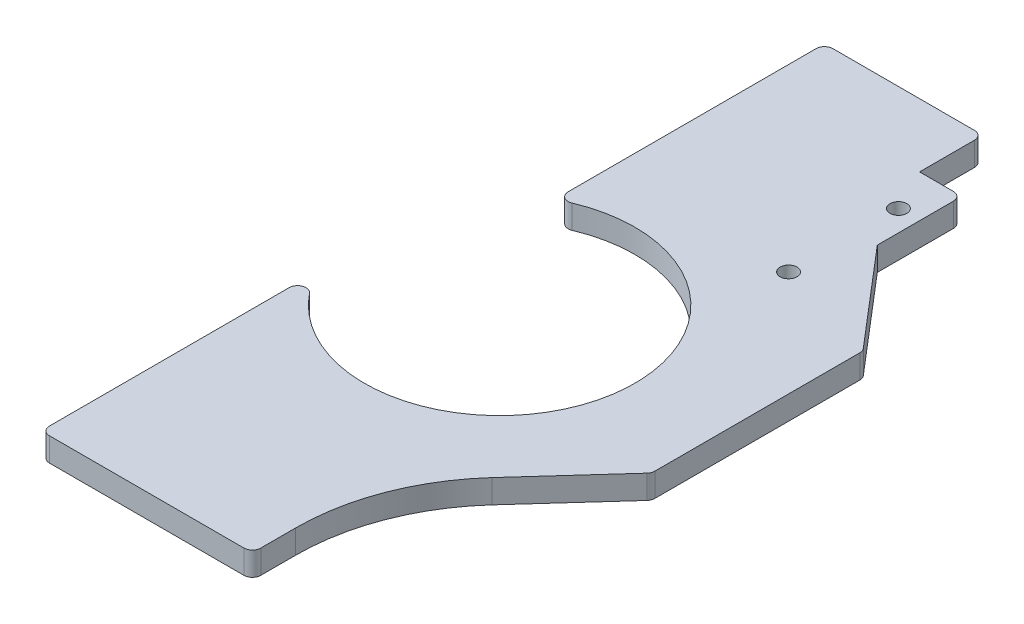
ISO-10303-21;
HEADER;
FILE_DESCRIPTION(('STEP AP214'),'2;1');
FILE_NAME('part.step','',(''),(''),'','','');
FILE_SCHEMA(('AUTOMOTIVE_DESIGN { 1 0 10303 214 1 1 1 1 }'));
ENDSEC;
DATA;
#1=APPLICATION_CONTEXT('core data for automotive mechanical design processes');
#2=APPLICATION_PROTOCOL_DEFINITION('international standard','automotive_design',2000,#1);
#3=PRODUCT_CONTEXT('',#1,'mechanical');
#4=PRODUCT('Part','Part','',(#3));
#5=PRODUCT_RELATED_PRODUCT_CATEGORY('part','',(#4));
#6=PRODUCT_DEFINITION_FORMATION('','',#4);
#7=PRODUCT_DEFINITION_CONTEXT('part definition',#1,'design');
#8=PRODUCT_DEFINITION('design','',#6,#7);
#9=PRODUCT_DEFINITION_SHAPE('','',#8);
#10=(LENGTH_UNIT() NAMED_UNIT(*) SI_UNIT(.MILLI.,.METRE.));
#11=(NAMED_UNIT(*) PLANE_ANGLE_UNIT() SI_UNIT($,.RADIAN.));
#12=(NAMED_UNIT(*) SI_UNIT($,.STERADIAN.) SOLID_ANGLE_UNIT());
#13=UNCERTAINTY_MEASURE_WITH_UNIT(LENGTH_MEASURE(1.E-05),#10,'distance_accuracy_value','');
#14=(GEOMETRIC_REPRESENTATION_CONTEXT(3) GLOBAL_UNCERTAINTY_ASSIGNED_CONTEXT((#13)) GLOBAL_UNIT_ASSIGNED_CONTEXT((#10,
#11,#12)) REPRESENTATION_CONTEXT('',''));
#15=CARTESIAN_POINT('',(0.,0.,0.));
#16=DIRECTION('',(0.,0.,1.));
#17=DIRECTION('',(1.,0.,0.));
#18=AXIS2_PLACEMENT_3D('',#15,#16,#17);
#19=CARTESIAN_POINT('',(15.14,5.6,92.));
#20=DIRECTION('',(0.,1.,0.));
#21=DIRECTION('',(0.,0.,1.));
#22=AXIS2_PLACEMENT_3D('',#19,#20,#21);
#23=PLANE('',#22);
#24=CARTESIAN_POINT('',(42.5,5.6,25.));
#25=DIRECTION('',(0.,1.,0.));
#26=DIRECTION('',(0.,0.,1.));
#27=AXIS2_PLACEMENT_3D('',#24,#25,#26);
#28=CIRCLE('',#27,2.00000000000001);
#29=CARTESIAN_POINT('',(42.5,5.6,27.));
#30=VERTEX_POINT('',#29);
#31=EDGE_CURVE('E395',#30,#30,#28,.T.);
#32=ORIENTED_EDGE('',*,*,#31,.F.);
#33=EDGE_LOOP('',(#32));
#34=FACE_BOUND('',#33,.T.);
#35=DIRECTION('',(0.,0.,1.));
#36=VECTOR('',#35,1.);
#37=CARTESIAN_POINT('',(-13.36,5.6,172.));
#38=LINE('',#37,#36);
#39=CARTESIAN_POINT('',(-13.36,5.6,113.301408404141));
#40=VERTEX_POINT('',#39);
#41=CARTESIAN_POINT('',(-13.36,5.6,170.));
#42=VERTEX_POINT('',#41);
#43=EDGE_CURVE('E281',#40,#42,#38,.T.);
#44=ORIENTED_EDGE('',*,*,#43,.T.);
#45=CARTESIAN_POINT('',(-11.36,5.6,170.));
#46=DIRECTION('',(0.,1.,0.));
#47=DIRECTION('',(0.,0.,1.));
#48=AXIS2_PLACEMENT_3D('',#45,#46,#47);
#49=CIRCLE('',#48,2.);
#50=CARTESIAN_POINT('',(-11.36,5.6,172.));
#51=VERTEX_POINT('',#50);
#52=EDGE_CURVE('E271',#42,#51,#49,.T.);
#53=ORIENTED_EDGE('',*,*,#52,.T.);
#54=DIRECTION('',(1.,0.,0.));
#55=VECTOR('',#54,1.);
#56=CARTESIAN_POINT('',(36.64,5.6,172.));
#57=LINE('',#56,#55);
#58=CARTESIAN_POINT('',(34.64,5.6,172.));
#59=VERTEX_POINT('',#58);
#60=EDGE_CURVE('E285',#51,#59,#57,.T.);
#61=ORIENTED_EDGE('',*,*,#60,.T.);
#62=CARTESIAN_POINT('',(34.64,5.6,170.));
#63=DIRECTION('',(0.,1.,0.));
#64=DIRECTION('',(0.,0.,1.));
#65=AXIS2_PLACEMENT_3D('',#62,#63,#64);
#66=CIRCLE('',#65,2.);
#67=CARTESIAN_POINT('',(36.64,5.6,170.));
#68=VERTEX_POINT('',#67);
#69=EDGE_CURVE('E267',#59,#68,#66,.T.);
#70=ORIENTED_EDGE('',*,*,#69,.T.);
#71=DIRECTION('',(0.,0.,-1.));
#72=VECTOR('',#71,1.);
#73=CARTESIAN_POINT('',(36.64,5.6,142.480487319359));
#74=LINE('',#73,#72);
#75=CARTESIAN_POINT('',(36.64,5.6,161.754308439395));
#76=VERTEX_POINT('',#75);
#77=EDGE_CURVE('E260',#68,#76,#74,.T.);
#78=ORIENTED_EDGE('',*,*,#77,.T.);
#79=CARTESIAN_POINT('',(86.64,5.6,161.754308439395));
#80=DIRECTION('',(0.,1.,0.));
#81=DIRECTION('',(0.,0.,1.));
#82=AXIS2_PLACEMENT_3D('',#79,#80,#81);
#83=CIRCLE('',#82,50.);
#84=CARTESIAN_POINT('',(49.576888197284,5.6,128.193531578611));
#85=VERTEX_POINT('',#84);
#86=EDGE_CURVE('E12',#76,#85,#83,.F.);
#87=ORIENTED_EDGE('',*,*,#86,.T.);
#88=DIRECTION('',(0.671215537215691,0.,-0.74126223605432));
#89=VECTOR('',#88,1.);
#90=CARTESIAN_POINT('',(67.5,5.6,108.4));
#91=LINE('',#90,#89);
#92=CARTESIAN_POINT('',(66.9825244721087,5.6,108.97147822963));
#93=VERTEX_POINT('',#92);
#94=EDGE_CURVE('E256',#85,#93,#91,.T.);
#95=ORIENTED_EDGE('',*,*,#94,.T.);
#96=CARTESIAN_POINT('',(65.5,5.6,107.629047155199));
#97=DIRECTION('',(0.,1.,0.));
#98=DIRECTION('',(0.,0.,1.));
#99=AXIS2_PLACEMENT_3D('',#96,#97,#98);
#100=CIRCLE('',#99,2.);
#101=CARTESIAN_POINT('',(67.5,5.6,107.629047155199));
#102=VERTEX_POINT('',#101);
#103=EDGE_CURVE('E247',#93,#102,#100,.T.);
#104=ORIENTED_EDGE('',*,*,#103,.T.);
#105=DIRECTION('',(0.,0.,-1.));
#106=VECTOR('',#105,1.);
#107=CARTESIAN_POINT('',(67.5,5.6,58.4));
#108=LINE('',#107,#106);
#109=CARTESIAN_POINT('',(67.5,5.6,59.1382462539569));
#110=VERTEX_POINT('',#109);
#111=EDGE_CURVE('E202',#102,#110,#108,.T.);
#112=ORIENTED_EDGE('',*,*,#111,.T.);
#113=CARTESIAN_POINT('',(65.5,5.6,59.1382462539569));
#114=DIRECTION('',(0.,1.,0.));
#115=DIRECTION('',(0.,0.,1.));
#116=AXIS2_PLACEMENT_3D('',#113,#114,#115);
#117=CIRCLE('',#116,2.);
#118=CARTESIAN_POINT('',(67.0203462016673,5.6,57.8388050559507));
#119=VERTEX_POINT('',#118);
#120=EDGE_CURVE('E197',#110,#119,#117,.T.);
#121=ORIENTED_EDGE('',*,*,#120,.T.);
#122=DIRECTION('',(-0.649720599003113,0.,-0.760173100833643));
#123=VECTOR('',#122,1.);
#124=CARTESIAN_POINT('',(47.5,5.6,35.));
#125=LINE('',#124,#123);
#126=CARTESIAN_POINT('',(47.5,5.6,35.));
#127=VERTEX_POINT('',#126);
#128=EDGE_CURVE('E188',#119,#127,#125,.T.);
#129=ORIENTED_EDGE('',*,*,#128,.T.);
#130=DIRECTION('',(0.,0.,-1.));
#131=VECTOR('',#130,1.);
#132=CARTESIAN_POINT('',(47.5,5.6,15.));
#133=LINE('',#132,#131);
#134=CARTESIAN_POINT('',(47.5,5.6,17.));
#135=VERTEX_POINT('',#134);
#136=EDGE_CURVE('E193',#127,#135,#133,.T.);
#137=ORIENTED_EDGE('',*,*,#136,.T.);
#138=CARTESIAN_POINT('',(45.5,5.6,17.));
#139=DIRECTION('',(0.,1.,0.));
#140=DIRECTION('',(0.,0.,1.));
#141=AXIS2_PLACEMENT_3D('',#138,#139,#140);
#142=CIRCLE('',#141,2.);
#143=CARTESIAN_POINT('',(45.5,5.6,15.));
#144=VERTEX_POINT('',#143);
#145=EDGE_CURVE('E237',#135,#144,#142,.T.);
#146=ORIENTED_EDGE('',*,*,#145,.T.);
#147=DIRECTION('',(-1.,0.,0.));
#148=VECTOR('',#147,1.);
#149=CARTESIAN_POINT('',(47.5,5.6,15.));
#150=LINE('',#149,#148);
#151=CARTESIAN_POINT('',(37.5,5.6,15.));
#152=VERTEX_POINT('',#151);
#153=EDGE_CURVE('E219',#144,#152,#150,.T.);
#154=ORIENTED_EDGE('',*,*,#153,.T.);
#155=DIRECTION('',(0.,0.,-1.));
#156=VECTOR('',#155,1.);
#157=CARTESIAN_POINT('',(37.5,5.6,0.));
#158=LINE('',#157,#156);
#159=CARTESIAN_POINT('',(37.5,5.6,2.));
#160=VERTEX_POINT('',#159);
#161=EDGE_CURVE('E223',#152,#160,#158,.T.);
#162=ORIENTED_EDGE('',*,*,#161,.T.);
#163=CARTESIAN_POINT('',(35.5,5.6,2.));
#164=DIRECTION('',(0.,1.,0.));
#165=DIRECTION('',(0.,0.,1.));
#166=AXIS2_PLACEMENT_3D('',#163,#164,#165);
#167=CIRCLE('',#166,2.);
#168=CARTESIAN_POINT('',(35.5,5.6,0.));
#169=VERTEX_POINT('',#168);
#170=EDGE_CURVE('E241',#160,#169,#167,.T.);
#171=ORIENTED_EDGE('',*,*,#170,.T.);
#172=DIRECTION('',(-1.,0.,0.));
#173=VECTOR('',#172,1.);
#174=CARTESIAN_POINT('',(0.,5.6,0.));
#175=LINE('',#174,#173);
#176=CARTESIAN_POINT('',(2.,5.6,0.));
#177=VERTEX_POINT('',#176);
#178=EDGE_CURVE('E364',#169,#177,#175,.T.);
#179=ORIENTED_EDGE('',*,*,#178,.T.);
#180=CARTESIAN_POINT('',(2.,5.6,2.));
#181=DIRECTION('',(0.,1.,0.));
#182=DIRECTION('',(0.,0.,1.));
#183=AXIS2_PLACEMENT_3D('',#180,#181,#182);
#184=CIRCLE('',#183,2.);
#185=CARTESIAN_POINT('',(0.,5.6,2.));
#186=VERTEX_POINT('',#185);
#187=EDGE_CURVE('E503',#177,#186,#184,.T.);
#188=ORIENTED_EDGE('',*,*,#187,.T.);
#189=DIRECTION('',(0.,0.,1.));
#190=VECTOR('',#189,1.);
#191=CARTESIAN_POINT('',(0.,5.6,0.));
#192=LINE('',#191,#190);
#193=CARTESIAN_POINT('',(0.,5.6,60.6417411197624));
#194=VERTEX_POINT('',#193);
#195=EDGE_CURVE('E362',#186,#194,#192,.T.);
#196=ORIENTED_EDGE('',*,*,#195,.T.);
#197=CARTESIAN_POINT('',(2.,5.6,60.6417411197624));
#198=DIRECTION('',(0.,1.,0.));
#199=DIRECTION('',(0.,0.,1.));
#200=AXIS2_PLACEMENT_3D('',#197,#198,#199);
#201=CIRCLE('',#200,2.);
#202=CARTESIAN_POINT('',(2.77294117647059,5.6,62.4863445833058));
#203=VERTEX_POINT('',#202);
#204=EDGE_CURVE('E378',#194,#203,#201,.T.);
#205=ORIENTED_EDGE('',*,*,#204,.T.);
#206=CARTESIAN_POINT('',(15.14,5.6,92.));
#207=DIRECTION('',(0.,-1.,0.));
#208=DIRECTION('',(0.,0.,1.));
#209=AXIS2_PLACEMENT_3D('',#206,#207,#208);
#210=CIRCLE('',#209,32.);
#211=CARTESIAN_POINT('',(-9.80117647058822,5.6,112.048384380368));
#212=VERTEX_POINT('',#211);
#213=EDGE_CURVE('E286',#203,#212,#210,.T.);
#214=ORIENTED_EDGE('',*,*,#213,.T.);
#215=CARTESIAN_POINT('',(-11.36,5.6,113.301408404141));
#216=DIRECTION('',(0.,1.,0.));
#217=DIRECTION('',(0.,0.,1.));
#218=AXIS2_PLACEMENT_3D('',#215,#216,#217);
#219=CIRCLE('',#218,2.);
#220=EDGE_CURVE('E382',#212,#40,#219,.T.);
#221=ORIENTED_EDGE('',*,*,#220,.T.);
#222=EDGE_LOOP('',(#44,#53,#61,#70,#78,#87,#95,#104,#112,#121,#129,#137,#146,#154,#162,#171,
#179,#188,#196,#205,#214,#221));
#223=FACE_BOUND('',#222,.T.);
#224=CARTESIAN_POINT('',(42.5,5.6,51.));
#225=DIRECTION('',(0.,1.,0.));
#226=DIRECTION('',(0.,0.,1.));
#227=AXIS2_PLACEMENT_3D('',#224,#225,#226);
#228=CIRCLE('',#227,2.);
#229=CARTESIAN_POINT('',(42.5,5.6,53.));
#230=VERTEX_POINT('',#229);
#231=EDGE_CURVE('E396',#230,#230,#228,.T.);
#232=ORIENTED_EDGE('',*,*,#231,.F.);
#233=EDGE_LOOP('',(#232));
#234=FACE_BOUND('',#233,.T.);
#235=ADVANCED_FACE('F38',(#34,#223,#234),#23,.T.);
#236=CARTESIAN_POINT('',(15.14,0.,92.));
#237=DIRECTION('',(0.,1.,0.));
#238=DIRECTION('',(0.,0.,1.));
#239=AXIS2_PLACEMENT_3D('',#236,#237,#238);
#240=PLANE('',#239);
#241=DIRECTION('',(1.,0.,0.));
#242=VECTOR('',#241,1.);
#243=CARTESIAN_POINT('',(36.64,0.,172.));
#244=LINE('',#243,#242);
#245=CARTESIAN_POINT('',(-11.36,0.,172.));
#246=VERTEX_POINT('',#245);
#247=CARTESIAN_POINT('',(34.64,0.,172.));
#248=VERTEX_POINT('',#247);
#249=EDGE_CURVE('E342',#246,#248,#244,.T.);
#250=ORIENTED_EDGE('',*,*,#249,.F.);
#251=CARTESIAN_POINT('',(-11.36,0.,170.));
#252=DIRECTION('',(0.,1.,0.));
#253=DIRECTION('',(0.,0.,1.));
#254=AXIS2_PLACEMENT_3D('',#251,#252,#253);
#255=CIRCLE('',#254,2.);
#256=CARTESIAN_POINT('',(-13.36,0.,170.));
#257=VERTEX_POINT('',#256);
#258=EDGE_CURVE('E510',#246,#257,#255,.F.);
#259=ORIENTED_EDGE('',*,*,#258,.T.);
#260=DIRECTION('',(0.,0.,1.));
#261=VECTOR('',#260,1.);
#262=CARTESIAN_POINT('',(-13.36,0.,172.));
#263=LINE('',#262,#261);
#264=CARTESIAN_POINT('',(-13.36,0.,113.301408404141));
#265=VERTEX_POINT('',#264);
#266=EDGE_CURVE('E346',#265,#257,#263,.T.);
#267=ORIENTED_EDGE('',*,*,#266,.F.);
#268=CARTESIAN_POINT('',(-11.36,0.,113.301408404141));
#269=DIRECTION('',(0.,1.,0.));
#270=DIRECTION('',(0.,0.,1.));
#271=AXIS2_PLACEMENT_3D('',#268,#269,#270);
#272=CIRCLE('',#271,2.);
#273=CARTESIAN_POINT('',(-9.80117647058822,0.,112.048384380368));
#274=VERTEX_POINT('',#273);
#275=EDGE_CURVE('E371',#265,#274,#272,.F.);
#276=ORIENTED_EDGE('',*,*,#275,.T.);
#277=CARTESIAN_POINT('',(15.14,0.,92.));
#278=DIRECTION('',(0.,-1.,0.));
#279=DIRECTION('',(0.,0.,1.));
#280=AXIS2_PLACEMENT_3D('',#277,#278,#279);
#281=CIRCLE('',#280,32.);
#282=CARTESIAN_POINT('',(2.77294117647059,0.,62.4863445833058));
#283=VERTEX_POINT('',#282);
#284=EDGE_CURVE('E548',#283,#274,#281,.T.);
#285=ORIENTED_EDGE('',*,*,#284,.F.);
#286=CARTESIAN_POINT('',(2.,0.,60.6417411197624));
#287=DIRECTION('',(0.,1.,0.));
#288=DIRECTION('',(0.,0.,1.));
#289=AXIS2_PLACEMENT_3D('',#286,#287,#288);
#290=CIRCLE('',#289,2.);
#291=CARTESIAN_POINT('',(0.,0.,60.6417411197624));
#292=VERTEX_POINT('',#291);
#293=EDGE_CURVE('E368',#283,#292,#290,.F.);
#294=ORIENTED_EDGE('',*,*,#293,.T.);
#295=DIRECTION('',(0.,0.,1.));
#296=VECTOR('',#295,1.);
#297=CARTESIAN_POINT('',(0.,0.,0.));
#298=LINE('',#297,#296);
#299=CARTESIAN_POINT('',(0.,0.,2.));
#300=VERTEX_POINT('',#299);
#301=EDGE_CURVE('E401',#300,#292,#298,.T.);
#302=ORIENTED_EDGE('',*,*,#301,.F.);
#303=CARTESIAN_POINT('',(2.,0.,2.));
#304=DIRECTION('',(0.,1.,0.));
#305=DIRECTION('',(0.,0.,1.));
#306=AXIS2_PLACEMENT_3D('',#303,#304,#305);
#307=CIRCLE('',#306,2.);
#308=CARTESIAN_POINT('',(2.,0.,0.));
#309=VERTEX_POINT('',#308);
#310=EDGE_CURVE('E525',#300,#309,#307,.F.);
#311=ORIENTED_EDGE('',*,*,#310,.T.);
#312=DIRECTION('',(-1.,0.,0.));
#313=VECTOR('',#312,1.);
#314=CARTESIAN_POINT('',(0.,0.,0.));
#315=LINE('',#314,#313);
#316=CARTESIAN_POINT('',(35.5,0.,0.));
#317=VERTEX_POINT('',#316);
#318=EDGE_CURVE('E359',#317,#309,#315,.T.);
#319=ORIENTED_EDGE('',*,*,#318,.F.);
#320=CARTESIAN_POINT('',(35.5,0.,2.));
#321=DIRECTION('',(0.,1.,0.));
#322=DIRECTION('',(0.,0.,1.));
#323=AXIS2_PLACEMENT_3D('',#320,#321,#322);
#324=CIRCLE('',#323,2.);
#325=CARTESIAN_POINT('',(37.5,0.,2.));
#326=VERTEX_POINT('',#325);
#327=EDGE_CURVE('E523',#317,#326,#324,.F.);
#328=ORIENTED_EDGE('',*,*,#327,.T.);
#329=DIRECTION('',(0.,0.,-1.));
#330=VECTOR('',#329,1.);
#331=CARTESIAN_POINT('',(37.5,0.,0.));
#332=LINE('',#331,#330);
#333=CARTESIAN_POINT('',(37.5,0.,15.));
#334=VERTEX_POINT('',#333);
#335=EDGE_CURVE('E356',#334,#326,#332,.T.);
#336=ORIENTED_EDGE('',*,*,#335,.F.);
#337=DIRECTION('',(-1.,0.,0.));
#338=VECTOR('',#337,1.);
#339=CARTESIAN_POINT('',(47.5,0.,15.));
#340=LINE('',#339,#338);
#341=CARTESIAN_POINT('',(45.5,0.,15.));
#342=VERTEX_POINT('',#341);
#343=EDGE_CURVE('E354',#342,#334,#340,.T.);
#344=ORIENTED_EDGE('',*,*,#343,.F.);
#345=CARTESIAN_POINT('',(45.5,0.,17.));
#346=DIRECTION('',(0.,1.,0.));
#347=DIRECTION('',(0.,0.,1.));
#348=AXIS2_PLACEMENT_3D('',#345,#346,#347);
#349=CIRCLE('',#348,2.);
#350=CARTESIAN_POINT('',(47.5,0.,17.));
#351=VERTEX_POINT('',#350);
#352=EDGE_CURVE('E521',#342,#351,#349,.F.);
#353=ORIENTED_EDGE('',*,*,#352,.T.);
#354=DIRECTION('',(0.,0.,-1.));
#355=VECTOR('',#354,1.);
#356=CARTESIAN_POINT('',(47.5,0.,15.));
#357=LINE('',#356,#355);
#358=CARTESIAN_POINT('',(47.5,0.,35.));
#359=VERTEX_POINT('',#358);
#360=EDGE_CURVE('E352',#359,#351,#357,.T.);
#361=ORIENTED_EDGE('',*,*,#360,.F.);
#362=DIRECTION('',(-0.649720599003113,0.,-0.760173100833643));
#363=VECTOR('',#362,1.);
#364=CARTESIAN_POINT('',(47.5,0.,35.));
#365=LINE('',#364,#363);
#366=CARTESIAN_POINT('',(67.0203462016673,0.,57.8388050559507));
#367=VERTEX_POINT('',#366);
#368=EDGE_CURVE('E208',#367,#359,#365,.T.);
#369=ORIENTED_EDGE('',*,*,#368,.F.);
#370=CARTESIAN_POINT('',(65.5,0.,59.1382462539569));
#371=DIRECTION('',(0.,1.,0.));
#372=DIRECTION('',(0.,0.,1.));
#373=AXIS2_PLACEMENT_3D('',#370,#371,#372);
#374=CIRCLE('',#373,2.);
#375=CARTESIAN_POINT('',(67.5,0.,59.1382462539569));
#376=VERTEX_POINT('',#375);
#377=EDGE_CURVE('E519',#367,#376,#374,.F.);
#378=ORIENTED_EDGE('',*,*,#377,.T.);
#379=DIRECTION('',(0.,0.,-1.));
#380=VECTOR('',#379,1.);
#381=CARTESIAN_POINT('',(67.5,0.,58.4));
#382=LINE('',#381,#380);
#383=CARTESIAN_POINT('',(67.5,0.,107.629047155199));
#384=VERTEX_POINT('',#383);
#385=EDGE_CURVE('E344',#384,#376,#382,.T.);
#386=ORIENTED_EDGE('',*,*,#385,.F.);
#387=CARTESIAN_POINT('',(65.5,0.,107.629047155199));
#388=DIRECTION('',(0.,1.,0.));
#389=DIRECTION('',(0.,0.,1.));
#390=AXIS2_PLACEMENT_3D('',#387,#388,#389);
#391=CIRCLE('',#390,2.);
#392=CARTESIAN_POINT('',(66.9825244721087,0.,108.97147822963));
#393=VERTEX_POINT('',#392);
#394=EDGE_CURVE('E516',#384,#393,#391,.F.);
#395=ORIENTED_EDGE('',*,*,#394,.T.);
#396=DIRECTION('',(0.671215537215691,0.,-0.74126223605432));
#397=VECTOR('',#396,1.);
#398=CARTESIAN_POINT('',(67.5,0.,108.4));
#399=LINE('',#398,#397);
#400=CARTESIAN_POINT('',(49.576888197284,0.,128.193531578611));
#401=VERTEX_POINT('',#400);
#402=EDGE_CURVE('E341',#401,#393,#399,.T.);
#403=ORIENTED_EDGE('',*,*,#402,.F.);
#404=CARTESIAN_POINT('',(86.64,0.,161.754308439395));
#405=DIRECTION('',(0.,1.,0.));
#406=DIRECTION('',(0.,0.,1.));
#407=AXIS2_PLACEMENT_3D('',#404,#405,#406);
#408=CIRCLE('',#407,50.);
#409=CARTESIAN_POINT('',(36.64,0.,161.754308439395));
#410=VERTEX_POINT('',#409);
#411=EDGE_CURVE('E47',#401,#410,#408,.T.);
#412=ORIENTED_EDGE('',*,*,#411,.T.);
#413=DIRECTION('',(0.,0.,-1.));
#414=VECTOR('',#413,1.);
#415=CARTESIAN_POINT('',(36.64,0.,142.480487319359));
#416=LINE('',#415,#414);
#417=CARTESIAN_POINT('',(36.64,0.,170.));
#418=VERTEX_POINT('',#417);
#419=EDGE_CURVE('E334',#418,#410,#416,.T.);
#420=ORIENTED_EDGE('',*,*,#419,.F.);
#421=CARTESIAN_POINT('',(34.64,0.,170.));
#422=DIRECTION('',(0.,1.,0.));
#423=DIRECTION('',(0.,0.,1.));
#424=AXIS2_PLACEMENT_3D('',#421,#422,#423);
#425=CIRCLE('',#424,2.);
#426=EDGE_CURVE('E339',#418,#248,#425,.F.);
#427=ORIENTED_EDGE('',*,*,#426,.T.);
#428=EDGE_LOOP('',(#250,#259,#267,#276,#285,#294,#302,#311,#319,#328,#336,#344,#353,#361,#369,
#378,#386,#395,#403,#412,#420,#427));
#429=FACE_BOUND('',#428,.T.);
#430=CARTESIAN_POINT('',(42.5,0.,25.));
#431=DIRECTION('',(0.,1.,0.));
#432=DIRECTION('',(0.,0.,1.));
#433=AXIS2_PLACEMENT_3D('',#430,#431,#432);
#434=CIRCLE('',#433,2.00000000000001);
#435=CARTESIAN_POINT('',(42.5,0.,27.));
#436=VERTEX_POINT('',#435);
#437=EDGE_CURVE('E393',#436,#436,#434,.T.);
#438=ORIENTED_EDGE('',*,*,#437,.T.);
#439=EDGE_LOOP('',(#438));
#440=FACE_BOUND('',#439,.T.);
#441=CARTESIAN_POINT('',(42.5,0.,51.));
#442=DIRECTION('',(0.,1.,0.));
#443=DIRECTION('',(0.,0.,1.));
#444=AXIS2_PLACEMENT_3D('',#441,#442,#443);
#445=CIRCLE('',#444,2.);
#446=CARTESIAN_POINT('',(42.5,0.,53.));
#447=VERTEX_POINT('',#446);
#448=EDGE_CURVE('E402',#447,#447,#445,.T.);
#449=ORIENTED_EDGE('',*,*,#448,.T.);
#450=EDGE_LOOP('',(#449));
#451=FACE_BOUND('',#450,.T.);
#452=ADVANCED_FACE('F337',(#429,#440,#451),#240,.F.);
#453=CARTESIAN_POINT('',(0.,5.6,0.));
#454=DIRECTION('',(1.,0.,0.));
#455=DIRECTION('',(0.,0.,-1.));
#456=AXIS2_PLACEMENT_3D('',#453,#454,#455);
#457=PLANE('',#456);
#458=ORIENTED_EDGE('',*,*,#195,.F.);
#459=DIRECTION('',(0.,-1.,0.));
#460=VECTOR('',#459,1.);
#461=CARTESIAN_POINT('',(0.,5.6,2.));
#462=LINE('',#461,#460);
#463=EDGE_CURVE('E304',#186,#300,#462,.T.);
#464=ORIENTED_EDGE('',*,*,#463,.T.);
#465=ORIENTED_EDGE('',*,*,#301,.T.);
#466=DIRECTION('',(0.,-1.,0.));
#467=VECTOR('',#466,1.);
#468=CARTESIAN_POINT('',(0.,5.6,60.6417411197624));
#469=LINE('',#468,#467);
#470=EDGE_CURVE('E531',#292,#194,#469,.F.);
#471=ORIENTED_EDGE('',*,*,#470,.T.);
#472=EDGE_LOOP('',(#458,#464,#465,#471));
#473=FACE_BOUND('',#472,.T.);
#474=ADVANCED_FACE('F418',(#473),#457,.F.);
#475=CARTESIAN_POINT('',(15.14,5.6,92.));
#476=DIRECTION('',(0.,-1.,0.));
#477=DIRECTION('',(0.,0.,-1.));
#478=AXIS2_PLACEMENT_3D('',#475,#476,#477);
#479=CYLINDRICAL_SURFACE('',#478,32.);
#480=ORIENTED_EDGE('',*,*,#284,.T.);
#481=DIRECTION('',(0.,-1.,0.));
#482=VECTOR('',#481,1.);
#483=CARTESIAN_POINT('',(-9.80117647058823,5.6,112.048384380368));
#484=LINE('',#483,#482);
#485=EDGE_CURVE('E376',#274,#212,#484,.F.);
#486=ORIENTED_EDGE('',*,*,#485,.T.);
#487=ORIENTED_EDGE('',*,*,#213,.F.);
#488=DIRECTION('',(0.,-1.,0.));
#489=VECTOR('',#488,1.);
#490=CARTESIAN_POINT('',(2.77294117647059,5.6,62.4863445833058));
#491=LINE('',#490,#489);
#492=EDGE_CURVE('E373',#203,#283,#491,.T.);
#493=ORIENTED_EDGE('',*,*,#492,.T.);
#494=EDGE_LOOP('',(#480,#486,#487,#493));
#495=FACE_BOUND('',#494,.T.);
#496=ADVANCED_FACE('F456',(#495),#479,.F.);
#497=CARTESIAN_POINT('',(-13.36,5.6,172.));
#498=DIRECTION('',(1.,0.,0.));
#499=DIRECTION('',(0.,0.,-1.));
#500=AXIS2_PLACEMENT_3D('',#497,#498,#499);
#501=PLANE('',#500);
#502=ORIENTED_EDGE('',*,*,#266,.T.);
#503=DIRECTION('',(0.,-1.,0.));
#504=VECTOR('',#503,1.);
#505=CARTESIAN_POINT('',(-13.36,5.6,170.));
#506=LINE('',#505,#504);
#507=EDGE_CURVE('E507',#257,#42,#506,.F.);
#508=ORIENTED_EDGE('',*,*,#507,.T.);
#509=ORIENTED_EDGE('',*,*,#43,.F.);
#510=DIRECTION('',(0.,-1.,0.));
#511=VECTOR('',#510,1.);
#512=CARTESIAN_POINT('',(-13.36,5.6,113.301408404141));
#513=LINE('',#512,#511);
#514=EDGE_CURVE('E212',#40,#265,#513,.T.);
#515=ORIENTED_EDGE('',*,*,#514,.T.);
#516=EDGE_LOOP('',(#502,#508,#509,#515));
#517=FACE_BOUND('',#516,.T.);
#518=ADVANCED_FACE('F452',(#517),#501,.F.);
#519=CARTESIAN_POINT('',(36.64,5.6,172.));
#520=DIRECTION('',(0.,0.,-1.));
#521=DIRECTION('',(-1.,0.,0.));
#522=AXIS2_PLACEMENT_3D('',#519,#520,#521);
#523=PLANE('',#522);
#524=ORIENTED_EDGE('',*,*,#60,.F.);
#525=DIRECTION('',(0.,-1.,0.));
#526=VECTOR('',#525,1.);
#527=CARTESIAN_POINT('',(-11.36,5.6,172.));
#528=LINE('',#527,#526);
#529=EDGE_CURVE('E527',#51,#246,#528,.T.);
#530=ORIENTED_EDGE('',*,*,#529,.T.);
#531=ORIENTED_EDGE('',*,*,#249,.T.);
#532=DIRECTION('',(0.,-1.,0.));
#533=VECTOR('',#532,1.);
#534=CARTESIAN_POINT('',(34.64,5.6,172.));
#535=LINE('',#534,#533);
#536=EDGE_CURVE('E530',#248,#59,#535,.F.);
#537=ORIENTED_EDGE('',*,*,#536,.T.);
#538=EDGE_LOOP('',(#524,#530,#531,#537));
#539=FACE_BOUND('',#538,.T.);
#540=ADVANCED_FACE('F449',(#539),#523,.F.);
#541=CARTESIAN_POINT('',(36.64,5.6,142.480487319359));
#542=DIRECTION('',(-1.,0.,0.));
#543=DIRECTION('',(0.,0.,1.));
#544=AXIS2_PLACEMENT_3D('',#541,#542,#543);
#545=PLANE('',#544);
#546=ORIENTED_EDGE('',*,*,#419,.T.);
#547=DIRECTION('',(0.,-1.,0.));
#548=VECTOR('',#547,1.);
#549=CARTESIAN_POINT('',(36.64,5.6,161.754308439395));
#550=LINE('',#549,#548);
#551=EDGE_CURVE('E60',#410,#76,#550,.F.);
#552=ORIENTED_EDGE('',*,*,#551,.T.);
#553=ORIENTED_EDGE('',*,*,#77,.F.);
#554=DIRECTION('',(0.,-1.,0.));
#555=VECTOR('',#554,1.);
#556=CARTESIAN_POINT('',(36.64,5.6,170.));
#557=LINE('',#556,#555);
#558=EDGE_CURVE('E275',#68,#418,#557,.T.);
#559=ORIENTED_EDGE('',*,*,#558,.T.);
#560=EDGE_LOOP('',(#546,#552,#553,#559));
#561=FACE_BOUND('',#560,.T.);
#562=ADVANCED_FACE('F333',(#561),#545,.F.);
#563=CARTESIAN_POINT('',(67.5,5.6,108.4));
#564=DIRECTION('',(-0.741262236054321,0.,-0.671215537215691));
#565=DIRECTION('',(-0.671215537215691,0.,0.741262236054321));
#566=AXIS2_PLACEMENT_3D('',#563,#564,#565);
#567=PLANE('',#566);
#568=ORIENTED_EDGE('',*,*,#94,.F.);
#569=DIRECTION('',(0.,-1.,0.));
#570=VECTOR('',#569,1.);
#571=CARTESIAN_POINT('',(49.576888197284,0.,128.193531578611));
#572=LINE('',#571,#570);
#573=EDGE_CURVE('E302',#85,#401,#572,.T.);
#574=ORIENTED_EDGE('',*,*,#573,.T.);
#575=ORIENTED_EDGE('',*,*,#402,.T.);
#576=DIRECTION('',(0.,-1.,0.));
#577=VECTOR('',#576,1.);
#578=CARTESIAN_POINT('',(66.9825244721087,5.6,108.97147822963));
#579=LINE('',#578,#577);
#580=EDGE_CURVE('E323',#393,#93,#579,.F.);
#581=ORIENTED_EDGE('',*,*,#580,.T.);
#582=EDGE_LOOP('',(#568,#574,#575,#581));
#583=FACE_BOUND('',#582,.T.);
#584=ADVANCED_FACE('F444',(#583),#567,.F.);
#585=CARTESIAN_POINT('',(67.5,5.6,58.4));
#586=DIRECTION('',(-1.,0.,0.));
#587=DIRECTION('',(0.,0.,1.));
#588=AXIS2_PLACEMENT_3D('',#585,#586,#587);
#589=PLANE('',#588);
#590=ORIENTED_EDGE('',*,*,#111,.F.);
#591=DIRECTION('',(0.,-1.,0.));
#592=VECTOR('',#591,1.);
#593=CARTESIAN_POINT('',(67.5,5.6,107.629047155199));
#594=LINE('',#593,#592);
#595=EDGE_CURVE('E326',#102,#384,#594,.T.);
#596=ORIENTED_EDGE('',*,*,#595,.T.);
#597=ORIENTED_EDGE('',*,*,#385,.T.);
#598=DIRECTION('',(0.,-1.,0.));
#599=VECTOR('',#598,1.);
#600=CARTESIAN_POINT('',(67.5,5.6,59.1382462539569));
#601=LINE('',#600,#599);
#602=EDGE_CURVE('E328',#376,#110,#601,.F.);
#603=ORIENTED_EDGE('',*,*,#602,.T.);
#604=EDGE_LOOP('',(#590,#596,#597,#603));
#605=FACE_BOUND('',#604,.T.);
#606=ADVANCED_FACE('F441',(#605),#589,.F.);
#607=CARTESIAN_POINT('',(47.5,5.6,35.));
#608=DIRECTION('',(-0.760173100833643,0.,0.649720599003114));
#609=DIRECTION('',(0.649720599003114,0.,0.760173100833643));
#610=AXIS2_PLACEMENT_3D('',#607,#608,#609);
#611=PLANE('',#610);
#612=ORIENTED_EDGE('',*,*,#128,.F.);
#613=DIRECTION('',(0.,-1.,0.));
#614=VECTOR('',#613,1.);
#615=CARTESIAN_POINT('',(67.0203462016673,5.6,57.8388050559507));
#616=LINE('',#615,#614);
#617=EDGE_CURVE('E321',#119,#367,#616,.T.);
#618=ORIENTED_EDGE('',*,*,#617,.T.);
#619=ORIENTED_EDGE('',*,*,#368,.T.);
#620=DIRECTION('',(0.,-1.,0.));
#621=VECTOR('',#620,1.);
#622=CARTESIAN_POINT('',(47.5,5.6,35.));
#623=LINE('',#622,#621);
#624=EDGE_CURVE('E205',#127,#359,#623,.T.);
#625=ORIENTED_EDGE('',*,*,#624,.F.);
#626=EDGE_LOOP('',(#612,#618,#619,#625));
#627=FACE_BOUND('',#626,.T.);
#628=ADVANCED_FACE('F206',(#627),#611,.F.);
#629=CARTESIAN_POINT('',(47.5,5.6,15.));
#630=DIRECTION('',(-1.,0.,0.));
#631=DIRECTION('',(0.,0.,1.));
#632=AXIS2_PLACEMENT_3D('',#629,#630,#631);
#633=PLANE('',#632);
#634=ORIENTED_EDGE('',*,*,#360,.T.);
#635=DIRECTION('',(0.,-1.,0.));
#636=VECTOR('',#635,1.);
#637=CARTESIAN_POINT('',(47.5,5.6,17.));
#638=LINE('',#637,#636);
#639=EDGE_CURVE('E217',#351,#135,#638,.F.);
#640=ORIENTED_EDGE('',*,*,#639,.T.);
#641=ORIENTED_EDGE('',*,*,#136,.F.);
#642=ORIENTED_EDGE('',*,*,#624,.T.);
#643=EDGE_LOOP('',(#634,#640,#641,#642));
#644=FACE_BOUND('',#643,.T.);
#645=ADVANCED_FACE('F215',(#644),#633,.F.);
#646=CARTESIAN_POINT('',(47.5,5.6,15.));
#647=DIRECTION('',(0.,0.,1.));
#648=DIRECTION('',(1.,0.,0.));
#649=AXIS2_PLACEMENT_3D('',#646,#647,#648);
#650=PLANE('',#649);
#651=ORIENTED_EDGE('',*,*,#153,.F.);
#652=DIRECTION('',(0.,-1.,0.));
#653=VECTOR('',#652,1.);
#654=CARTESIAN_POINT('',(45.5,5.6,15.));
#655=LINE('',#654,#653);
#656=EDGE_CURVE('E318',#144,#342,#655,.T.);
#657=ORIENTED_EDGE('',*,*,#656,.T.);
#658=ORIENTED_EDGE('',*,*,#343,.T.);
#659=DIRECTION('',(0.,-1.,0.));
#660=VECTOR('',#659,1.);
#661=CARTESIAN_POINT('',(37.5,5.6,15.));
#662=LINE('',#661,#660);
#663=EDGE_CURVE('E213',#152,#334,#662,.T.);
#664=ORIENTED_EDGE('',*,*,#663,.F.);
#665=EDGE_LOOP('',(#651,#657,#658,#664));
#666=FACE_BOUND('',#665,.T.);
#667=ADVANCED_FACE('F432',(#666),#650,.F.);
#668=CARTESIAN_POINT('',(37.5,5.6,0.));
#669=DIRECTION('',(-1.,0.,0.));
#670=DIRECTION('',(0.,0.,1.));
#671=AXIS2_PLACEMENT_3D('',#668,#669,#670);
#672=PLANE('',#671);
#673=ORIENTED_EDGE('',*,*,#335,.T.);
#674=DIRECTION('',(0.,-1.,0.));
#675=VECTOR('',#674,1.);
#676=CARTESIAN_POINT('',(37.5,5.6,2.));
#677=LINE('',#676,#675);
#678=EDGE_CURVE('E308',#326,#160,#677,.F.);
#679=ORIENTED_EDGE('',*,*,#678,.T.);
#680=ORIENTED_EDGE('',*,*,#161,.F.);
#681=ORIENTED_EDGE('',*,*,#663,.T.);
#682=EDGE_LOOP('',(#673,#679,#680,#681));
#683=FACE_BOUND('',#682,.T.);
#684=ADVANCED_FACE('F428',(#683),#672,.F.);
#685=CARTESIAN_POINT('',(0.,5.6,0.));
#686=DIRECTION('',(0.,0.,1.));
#687=DIRECTION('',(1.,0.,0.));
#688=AXIS2_PLACEMENT_3D('',#685,#686,#687);
#689=PLANE('',#688);
#690=ORIENTED_EDGE('',*,*,#178,.F.);
#691=DIRECTION('',(0.,-1.,0.));
#692=VECTOR('',#691,1.);
#693=CARTESIAN_POINT('',(35.5,5.6,0.));
#694=LINE('',#693,#692);
#695=EDGE_CURVE('E312',#169,#317,#694,.T.);
#696=ORIENTED_EDGE('',*,*,#695,.T.);
#697=ORIENTED_EDGE('',*,*,#318,.T.);
#698=DIRECTION('',(0.,-1.,0.));
#699=VECTOR('',#698,1.);
#700=CARTESIAN_POINT('',(2.,5.6,0.));
#701=LINE('',#700,#699);
#702=EDGE_CURVE('E315',#309,#177,#701,.F.);
#703=ORIENTED_EDGE('',*,*,#702,.T.);
#704=EDGE_LOOP('',(#690,#696,#697,#703));
#705=FACE_BOUND('',#704,.T.);
#706=ADVANCED_FACE('F425',(#705),#689,.F.);
#707=CARTESIAN_POINT('',(42.5,5.6,25.));
#708=DIRECTION('',(0.,-1.,0.));
#709=DIRECTION('',(0.,0.,-1.));
#710=AXIS2_PLACEMENT_3D('',#707,#708,#709);
#711=CYLINDRICAL_SURFACE('',#710,2.00000000000001);
#712=ORIENTED_EDGE('',*,*,#31,.T.);
#713=EDGE_LOOP('',(#712));
#714=FACE_BOUND('',#713,.T.);
#715=ORIENTED_EDGE('',*,*,#437,.F.);
#716=EDGE_LOOP('',(#715));
#717=FACE_BOUND('',#716,.T.);
#718=ADVANCED_FACE('F422',(#714,#717),#711,.F.);
#719=CARTESIAN_POINT('',(42.5,5.6,51.));
#720=DIRECTION('',(0.,-1.,0.));
#721=DIRECTION('',(0.,0.,-1.));
#722=AXIS2_PLACEMENT_3D('',#719,#720,#721);
#723=CYLINDRICAL_SURFACE('',#722,2.);
#724=ORIENTED_EDGE('',*,*,#231,.T.);
#725=EDGE_LOOP('',(#724));
#726=FACE_BOUND('',#725,.T.);
#727=ORIENTED_EDGE('',*,*,#448,.F.);
#728=EDGE_LOOP('',(#727));
#729=FACE_BOUND('',#728,.T.);
#730=ADVANCED_FACE('F410',(#726,#729),#723,.F.);
#731=CARTESIAN_POINT('',(-11.36,5.6,113.301408404141));
#732=DIRECTION('',(0.,-1.,0.));
#733=DIRECTION('',(0.,0.,-1.));
#734=AXIS2_PLACEMENT_3D('',#731,#732,#733);
#735=CYLINDRICAL_SURFACE('',#734,2.);
#736=ORIENTED_EDGE('',*,*,#220,.F.);
#737=ORIENTED_EDGE('',*,*,#485,.F.);
#738=ORIENTED_EDGE('',*,*,#275,.F.);
#739=ORIENTED_EDGE('',*,*,#514,.F.);
#740=EDGE_LOOP('',(#736,#737,#738,#739));
#741=FACE_BOUND('',#740,.T.);
#742=ADVANCED_FACE('F464',(#741),#735,.T.);
#743=CARTESIAN_POINT('',(2.,5.6,60.6417411197624));
#744=DIRECTION('',(0.,-1.,0.));
#745=DIRECTION('',(0.,0.,-1.));
#746=AXIS2_PLACEMENT_3D('',#743,#744,#745);
#747=CYLINDRICAL_SURFACE('',#746,2.);
#748=ORIENTED_EDGE('',*,*,#204,.F.);
#749=ORIENTED_EDGE('',*,*,#470,.F.);
#750=ORIENTED_EDGE('',*,*,#293,.F.);
#751=ORIENTED_EDGE('',*,*,#492,.F.);
#752=EDGE_LOOP('',(#748,#749,#750,#751));
#753=FACE_BOUND('',#752,.T.);
#754=ADVANCED_FACE('F467',(#753),#747,.T.);
#755=CARTESIAN_POINT('',(-11.36,5.6,170.));
#756=DIRECTION('',(0.,-1.,0.));
#757=DIRECTION('',(0.,0.,-1.));
#758=AXIS2_PLACEMENT_3D('',#755,#756,#757);
#759=CYLINDRICAL_SURFACE('',#758,2.);
#760=ORIENTED_EDGE('',*,*,#52,.F.);
#761=ORIENTED_EDGE('',*,*,#507,.F.);
#762=ORIENTED_EDGE('',*,*,#258,.F.);
#763=ORIENTED_EDGE('',*,*,#529,.F.);
#764=EDGE_LOOP('',(#760,#761,#762,#763));
#765=FACE_BOUND('',#764,.T.);
#766=ADVANCED_FACE('F471',(#765),#759,.T.);
#767=CARTESIAN_POINT('',(34.64,5.6,170.));
#768=DIRECTION('',(0.,-1.,0.));
#769=DIRECTION('',(0.,0.,-1.));
#770=AXIS2_PLACEMENT_3D('',#767,#768,#769);
#771=CYLINDRICAL_SURFACE('',#770,2.);
#772=ORIENTED_EDGE('',*,*,#69,.F.);
#773=ORIENTED_EDGE('',*,*,#536,.F.);
#774=ORIENTED_EDGE('',*,*,#426,.F.);
#775=ORIENTED_EDGE('',*,*,#558,.F.);
#776=EDGE_LOOP('',(#772,#773,#774,#775));
#777=FACE_BOUND('',#776,.T.);
#778=ADVANCED_FACE('F475',(#777),#771,.T.);
#779=CARTESIAN_POINT('',(65.5,5.6,107.629047155199));
#780=DIRECTION('',(0.,-1.,0.));
#781=DIRECTION('',(0.,0.,-1.));
#782=AXIS2_PLACEMENT_3D('',#779,#780,#781);
#783=CYLINDRICAL_SURFACE('',#782,2.);
#784=ORIENTED_EDGE('',*,*,#103,.F.);
#785=ORIENTED_EDGE('',*,*,#580,.F.);
#786=ORIENTED_EDGE('',*,*,#394,.F.);
#787=ORIENTED_EDGE('',*,*,#595,.F.);
#788=EDGE_LOOP('',(#784,#785,#786,#787));
#789=FACE_BOUND('',#788,.T.);
#790=ADVANCED_FACE('F479',(#789),#783,.T.);
#791=CARTESIAN_POINT('',(65.5,5.6,59.1382462539569));
#792=DIRECTION('',(0.,-1.,0.));
#793=DIRECTION('',(0.,0.,-1.));
#794=AXIS2_PLACEMENT_3D('',#791,#792,#793);
#795=CYLINDRICAL_SURFACE('',#794,2.);
#796=ORIENTED_EDGE('',*,*,#120,.F.);
#797=ORIENTED_EDGE('',*,*,#602,.F.);
#798=ORIENTED_EDGE('',*,*,#377,.F.);
#799=ORIENTED_EDGE('',*,*,#617,.F.);
#800=EDGE_LOOP('',(#796,#797,#798,#799));
#801=FACE_BOUND('',#800,.T.);
#802=ADVANCED_FACE('F482',(#801),#795,.T.);
#803=CARTESIAN_POINT('',(45.5,5.6,17.));
#804=DIRECTION('',(0.,-1.,0.));
#805=DIRECTION('',(0.,0.,-1.));
#806=AXIS2_PLACEMENT_3D('',#803,#804,#805);
#807=CYLINDRICAL_SURFACE('',#806,2.);
#808=ORIENTED_EDGE('',*,*,#145,.F.);
#809=ORIENTED_EDGE('',*,*,#639,.F.);
#810=ORIENTED_EDGE('',*,*,#352,.F.);
#811=ORIENTED_EDGE('',*,*,#656,.F.);
#812=EDGE_LOOP('',(#808,#809,#810,#811));
#813=FACE_BOUND('',#812,.T.);
#814=ADVANCED_FACE('F486',(#813),#807,.T.);
#815=CARTESIAN_POINT('',(35.5,5.6,2.));
#816=DIRECTION('',(0.,-1.,0.));
#817=DIRECTION('',(0.,0.,-1.));
#818=AXIS2_PLACEMENT_3D('',#815,#816,#817);
#819=CYLINDRICAL_SURFACE('',#818,2.);
#820=ORIENTED_EDGE('',*,*,#170,.F.);
#821=ORIENTED_EDGE('',*,*,#678,.F.);
#822=ORIENTED_EDGE('',*,*,#327,.F.);
#823=ORIENTED_EDGE('',*,*,#695,.F.);
#824=EDGE_LOOP('',(#820,#821,#822,#823));
#825=FACE_BOUND('',#824,.T.);
#826=ADVANCED_FACE('F490',(#825),#819,.T.);
#827=CARTESIAN_POINT('',(2.,5.6,2.));
#828=DIRECTION('',(0.,-1.,0.));
#829=DIRECTION('',(0.,0.,-1.));
#830=AXIS2_PLACEMENT_3D('',#827,#828,#829);
#831=CYLINDRICAL_SURFACE('',#830,2.);
#832=ORIENTED_EDGE('',*,*,#187,.F.);
#833=ORIENTED_EDGE('',*,*,#702,.F.);
#834=ORIENTED_EDGE('',*,*,#310,.F.);
#835=ORIENTED_EDGE('',*,*,#463,.F.);
#836=EDGE_LOOP('',(#832,#833,#834,#835));
#837=FACE_BOUND('',#836,.T.);
#838=ADVANCED_FACE('F493',(#837),#831,.T.);
#839=CARTESIAN_POINT('',(86.64,5.6,161.754308439395));
#840=DIRECTION('',(0.,1.,0.));
#841=DIRECTION('',(0.,0.,1.));
#842=AXIS2_PLACEMENT_3D('',#839,#840,#841);
#843=CYLINDRICAL_SURFACE('',#842,50.);
#844=ORIENTED_EDGE('',*,*,#86,.F.);
#845=ORIENTED_EDGE('',*,*,#551,.F.);
#846=ORIENTED_EDGE('',*,*,#411,.F.);
#847=ORIENTED_EDGE('',*,*,#573,.F.);
#848=EDGE_LOOP('',(#844,#845,#846,#847));
#849=FACE_BOUND('',#848,.T.);
#850=ADVANCED_FACE('F40',(#849),#843,.F.);
#851=CLOSED_SHELL('',(#235,#452,#474,#496,#518,#540,#562,#584,#606,#628,#645,#667,#684,#706,
#718,#730,#742,#754,#766,#778,#790,#802,#814,#826,#838,#850));
#852=MANIFOLD_SOLID_BREP('B2',#851);
#853=ADVANCED_BREP_SHAPE_REPRESENTATION('',(#18,#852),#14);
#854=SHAPE_DEFINITION_REPRESENTATION(#9,#853);
ENDSEC;
END-ISO-10303-21;
